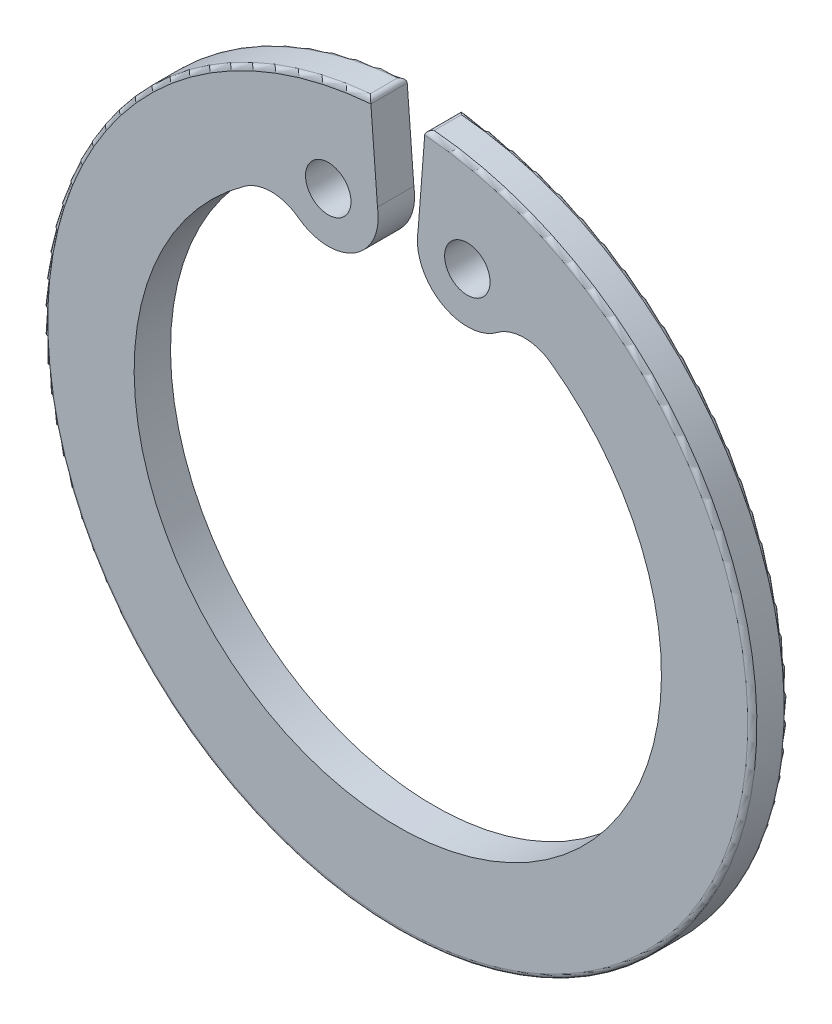
ISO-10303-21;
HEADER;
FILE_DESCRIPTION(('STEP AP214'),'2;1');
FILE_NAME('part.step','',(''),(''),'','','');
FILE_SCHEMA(('AUTOMOTIVE_DESIGN { 1 0 10303 214 1 1 1 1 }'));
ENDSEC;
DATA;
#1=APPLICATION_CONTEXT('core data for automotive mechanical design processes');
#2=APPLICATION_PROTOCOL_DEFINITION('international standard','automotive_design',2000,#1);
#3=PRODUCT_CONTEXT('',#1,'mechanical');
#4=PRODUCT('Part','Part','',(#3));
#5=PRODUCT_RELATED_PRODUCT_CATEGORY('part','',(#4));
#6=PRODUCT_DEFINITION_FORMATION('','',#4);
#7=PRODUCT_DEFINITION_CONTEXT('part definition',#1,'design');
#8=PRODUCT_DEFINITION('design','',#6,#7);
#9=PRODUCT_DEFINITION_SHAPE('','',#8);
#10=(LENGTH_UNIT() NAMED_UNIT(*) SI_UNIT(.MILLI.,.METRE.));
#11=(NAMED_UNIT(*) PLANE_ANGLE_UNIT() SI_UNIT($,.RADIAN.));
#12=(NAMED_UNIT(*) SI_UNIT($,.STERADIAN.) SOLID_ANGLE_UNIT());
#13=UNCERTAINTY_MEASURE_WITH_UNIT(LENGTH_MEASURE(1.E-05),#10,'distance_accuracy_value','');
#14=(GEOMETRIC_REPRESENTATION_CONTEXT(3) GLOBAL_UNCERTAINTY_ASSIGNED_CONTEXT((#13)) GLOBAL_UNIT_ASSIGNED_CONTEXT((#10,
#11,#12)) REPRESENTATION_CONTEXT('',''));
#15=CARTESIAN_POINT('',(0.,0.,0.));
#16=DIRECTION('',(0.,0.,1.));
#17=DIRECTION('',(1.,0.,0.));
#18=AXIS2_PLACEMENT_3D('',#15,#16,#17);
#19=CARTESIAN_POINT('',(0.,0.,-1.));
#20=DIRECTION('',(0.,0.,1.));
#21=DIRECTION('',(1.,0.,0.));
#22=AXIS2_PLACEMENT_3D('',#19,#20,#21);
#23=CYLINDRICAL_SURFACE('',#22,14.5);
#24=CARTESIAN_POINT('',(0.,0.,1.));
#25=DIRECTION('',(0.,0.,1.));
#26=DIRECTION('',(1.,0.,0.));
#27=AXIS2_PLACEMENT_3D('',#24,#25,#26);
#28=CIRCLE('',#27,14.5);
#29=CARTESIAN_POINT('',(-8.41002014883928,11.8119245297334,1.));
#30=VERTEX_POINT('',#29);
#31=CARTESIAN_POINT('',(8.4100201488393,11.8119245297334,1.));
#32=VERTEX_POINT('',#31);
#33=EDGE_CURVE('E270',#30,#32,#28,.T.);
#34=ORIENTED_EDGE('',*,*,#33,.T.);
#35=DIRECTION('',(0.,0.,1.));
#36=VECTOR('',#35,1.);
#37=CARTESIAN_POINT('',(8.4100201488393,11.8119245297334,-1.));
#38=LINE('',#37,#36);
#39=CARTESIAN_POINT('',(8.4100201488393,11.8119245297334,-1.));
#40=VERTEX_POINT('',#39);
#41=EDGE_CURVE('E163',#32,#40,#38,.F.);
#42=ORIENTED_EDGE('',*,*,#41,.T.);
#43=CARTESIAN_POINT('',(0.,0.,-1.));
#44=DIRECTION('',(0.,0.,1.));
#45=DIRECTION('',(1.,0.,0.));
#46=AXIS2_PLACEMENT_3D('',#43,#44,#45);
#47=CIRCLE('',#46,14.5);
#48=CARTESIAN_POINT('',(-8.41002014883928,11.8119245297334,-1.));
#49=VERTEX_POINT('',#48);
#50=EDGE_CURVE('E235',#49,#40,#47,.T.);
#51=ORIENTED_EDGE('',*,*,#50,.F.);
#52=DIRECTION('',(0.,0.,1.));
#53=VECTOR('',#52,1.);
#54=CARTESIAN_POINT('',(-8.41002014883928,11.8119245297334,-1.));
#55=LINE('',#54,#53);
#56=EDGE_CURVE('E156',#49,#30,#55,.T.);
#57=ORIENTED_EDGE('',*,*,#56,.T.);
#58=EDGE_LOOP('',(#34,#42,#51,#57));
#59=FACE_BOUND('',#58,.T.);
#60=ADVANCED_FACE('F33',(#59),#23,.F.);
#61=CARTESIAN_POINT('',(0.,0.,-1.));
#62=DIRECTION('',(-0.997037030524286,0.0769230769230779,0.));
#63=DIRECTION('',(-0.0769230769230779,-0.997037030524286,0.));
#64=AXIS2_PLACEMENT_3D('',#61,#62,#63);
#65=PLANE('',#64);
#66=DIRECTION('',(-0.0769230769230779,-0.997037030524286,0.));
#67=VECTOR('',#66,1.);
#68=CARTESIAN_POINT('',(0.,0.,1.));
#69=LINE('',#68,#67);
#70=CARTESIAN_POINT('',(1.48064435037849,19.1913442027309,1.));
#71=VERTEX_POINT('',#70);
#72=CARTESIAN_POINT('',(1.11538461538463,14.4570369426021,1.));
#73=VERTEX_POINT('',#72);
#74=EDGE_CURVE('E54',#71,#73,#69,.T.);
#75=ORIENTED_EDGE('',*,*,#74,.F.);
#76=DIRECTION('',(0.,0.,1.));
#77=VECTOR('',#76,1.);
#78=CARTESIAN_POINT('',(1.48064435037849,19.1913442027309,-1.));
#79=LINE('',#78,#77);
#80=CARTESIAN_POINT('',(1.48064435037849,19.1913442027309,-1.));
#81=VERTEX_POINT('',#80);
#82=EDGE_CURVE('E11',#71,#81,#79,.F.);
#83=ORIENTED_EDGE('',*,*,#82,.T.);
#84=DIRECTION('',(-0.0769230769230779,-0.997037030524286,0.));
#85=VECTOR('',#84,1.);
#86=CARTESIAN_POINT('',(0.,0.,-1.));
#87=LINE('',#86,#85);
#88=CARTESIAN_POINT('',(1.11538461538463,14.4570369426021,-1.));
#89=VERTEX_POINT('',#88);
#90=EDGE_CURVE('E125',#81,#89,#87,.T.);
#91=ORIENTED_EDGE('',*,*,#90,.T.);
#92=DIRECTION('',(0.,0.,1.));
#93=VECTOR('',#92,1.);
#94=CARTESIAN_POINT('',(1.11538461538463,14.4570369426021,-1.));
#95=LINE('',#94,#93);
#96=EDGE_CURVE('E129',#89,#73,#95,.T.);
#97=ORIENTED_EDGE('',*,*,#96,.T.);
#98=EDGE_LOOP('',(#75,#83,#91,#97));
#99=FACE_BOUND('',#98,.T.);
#100=ADVANCED_FACE('F127',(#99),#65,.T.);
#101=CARTESIAN_POINT('',(0.,0.,-1.));
#102=DIRECTION('',(0.,0.,1.));
#103=DIRECTION('',(1.,0.,0.));
#104=AXIS2_PLACEMENT_3D('',#101,#102,#103);
#105=CYLINDRICAL_SURFACE('',#104,19.5);
#106=DIRECTION('',(0.,0.,1.));
#107=VECTOR('',#106,1.);
#108=CARTESIAN_POINT('',(-1.75236988863303,19.4211019196495,-1.));
#109=LINE('',#108,#107);
#110=CARTESIAN_POINT('',(-1.75236988863303,19.4211019196495,0.75));
#111=VERTEX_POINT('',#110);
#112=CARTESIAN_POINT('',(-1.75236988863303,19.4211019196495,-0.75));
#113=VERTEX_POINT('',#112);
#114=EDGE_CURVE('E179',#111,#113,#109,.F.);
#115=ORIENTED_EDGE('',*,*,#114,.T.);
#116=CARTESIAN_POINT('',(0.,0.,-0.75));
#117=DIRECTION('',(0.,0.,1.));
#118=DIRECTION('',(1.,0.,0.));
#119=AXIS2_PLACEMENT_3D('',#116,#117,#118);
#120=CIRCLE('',#119,19.5);
#121=CARTESIAN_POINT('',(1.75236988863306,19.4211019196495,-0.75));
#122=VERTEX_POINT('',#121);
#123=EDGE_CURVE('E181',#113,#122,#120,.T.);
#124=ORIENTED_EDGE('',*,*,#123,.T.);
#125=DIRECTION('',(0.,0.,1.));
#126=VECTOR('',#125,1.);
#127=CARTESIAN_POINT('',(1.75236988863306,19.4211019196495,-1.));
#128=LINE('',#127,#126);
#129=CARTESIAN_POINT('',(1.75236988863306,19.4211019196495,0.75));
#130=VERTEX_POINT('',#129);
#131=EDGE_CURVE('E175',#122,#130,#128,.T.);
#132=ORIENTED_EDGE('',*,*,#131,.T.);
#133=CARTESIAN_POINT('',(0.,0.,0.75));
#134=DIRECTION('',(0.,0.,1.));
#135=DIRECTION('',(1.,0.,0.));
#136=AXIS2_PLACEMENT_3D('',#133,#134,#135);
#137=CIRCLE('',#136,19.5);
#138=EDGE_CURVE('E177',#130,#111,#137,.F.);
#139=ORIENTED_EDGE('',*,*,#138,.T.);
#140=EDGE_LOOP('',(#115,#124,#132,#139));
#141=FACE_BOUND('',#140,.T.);
#142=ADVANCED_FACE('F238',(#141),#105,.T.);
#143=CARTESIAN_POINT('',(0.,0.,-1.));
#144=DIRECTION('',(0.997037030524286,0.0769230769230759,0.));
#145=DIRECTION('',(-0.0769230769230759,0.997037030524286,0.));
#146=AXIS2_PLACEMENT_3D('',#143,#144,#145);
#147=PLANE('',#146);
#148=DIRECTION('',(-0.0769230769230759,0.997037030524286,0.));
#149=VECTOR('',#148,1.);
#150=CARTESIAN_POINT('',(0.,0.,-1.));
#151=LINE('',#150,#149);
#152=CARTESIAN_POINT('',(-1.1153846153846,14.4570369426021,-1.));
#153=VERTEX_POINT('',#152);
#154=CARTESIAN_POINT('',(-1.48064435037845,19.1913442027309,-1.));
#155=VERTEX_POINT('',#154);
#156=EDGE_CURVE('E134',#153,#155,#151,.T.);
#157=ORIENTED_EDGE('',*,*,#156,.T.);
#158=DIRECTION('',(0.,0.,1.));
#159=VECTOR('',#158,1.);
#160=CARTESIAN_POINT('',(-1.48064435037845,19.1913442027309,-1.));
#161=LINE('',#160,#159);
#162=CARTESIAN_POINT('',(-1.48064435037845,19.1913442027309,1.));
#163=VERTEX_POINT('',#162);
#164=EDGE_CURVE('E187',#155,#163,#161,.T.);
#165=ORIENTED_EDGE('',*,*,#164,.T.);
#166=DIRECTION('',(-0.0769230769230759,0.997037030524286,0.));
#167=VECTOR('',#166,1.);
#168=CARTESIAN_POINT('',(0.,0.,1.));
#169=LINE('',#168,#167);
#170=CARTESIAN_POINT('',(-1.1153846153846,14.4570369426021,1.));
#171=VERTEX_POINT('',#170);
#172=EDGE_CURVE('E245',#171,#163,#169,.T.);
#173=ORIENTED_EDGE('',*,*,#172,.F.);
#174=DIRECTION('',(0.,0.,1.));
#175=VECTOR('',#174,1.);
#176=CARTESIAN_POINT('',(-1.1153846153846,14.4570369426021,-1.));
#177=LINE('',#176,#175);
#178=EDGE_CURVE('E154',#153,#171,#177,.T.);
#179=ORIENTED_EDGE('',*,*,#178,.F.);
#180=EDGE_LOOP('',(#157,#165,#173,#179));
#181=FACE_BOUND('',#180,.T.);
#182=ADVANCED_FACE('F249',(#181),#147,.T.);
#183=CARTESIAN_POINT('',(0.,0.,-1.));
#184=DIRECTION('',(0.,0.,1.));
#185=DIRECTION('',(1.,0.,0.));
#186=AXIS2_PLACEMENT_3D('',#183,#184,#185);
#187=PLANE('',#186);
#188=CARTESIAN_POINT('',(1.48076923076925,19.1929628375925,-1.));
#189=VERTEX_POINT('',#188);
#190=EDGE_CURVE('E133',#189,#81,#87,.T.);
#191=ORIENTED_EDGE('',*,*,#190,.F.);
#192=CARTESIAN_POINT('',(0.,0.,-1.));
#193=DIRECTION('',(0.,0.,1.));
#194=DIRECTION('',(1.,0.,0.));
#195=AXIS2_PLACEMENT_3D('',#192,#193,#194);
#196=CIRCLE('',#195,19.25);
#197=CARTESIAN_POINT('',(-1.48076923076921,19.1929628375925,-1.));
#198=VERTEX_POINT('',#197);
#199=EDGE_CURVE('E184',#189,#198,#196,.F.);
#200=ORIENTED_EDGE('',*,*,#199,.T.);
#201=EDGE_CURVE('E231',#155,#198,#151,.T.);
#202=ORIENTED_EDGE('',*,*,#201,.F.);
#203=ORIENTED_EDGE('',*,*,#156,.F.);
#204=CARTESIAN_POINT('',(-3.82482119121912,13.9864485433294,-1.));
#205=DIRECTION('',(0.,0.,1.));
#206=DIRECTION('',(1.,0.,0.));
#207=AXIS2_PLACEMENT_3D('',#204,#205,#206);
#208=CIRCLE('',#207,2.75);
#209=CARTESIAN_POINT('',(-5.46706644457654,11.7806537822909,-1.));
#210=VERTEX_POINT('',#209);
#211=EDGE_CURVE('E254',#153,#210,#208,.F.);
#212=ORIENTED_EDGE('',*,*,#211,.T.);
#213=CARTESIAN_POINT('',(-6.96001667490147,9.77538581771039,-1.));
#214=DIRECTION('',(0.,0.,1.));
#215=DIRECTION('',(1.,0.,0.));
#216=AXIS2_PLACEMENT_3D('',#213,#214,#215);
#217=CIRCLE('',#216,2.5);
#218=EDGE_CURVE('E171',#210,#49,#217,.T.);
#219=ORIENTED_EDGE('',*,*,#218,.T.);
#220=ORIENTED_EDGE('',*,*,#50,.T.);
#221=CARTESIAN_POINT('',(6.96001667490149,9.77538581771037,-1.));
#222=DIRECTION('',(0.,0.,1.));
#223=DIRECTION('',(1.,0.,0.));
#224=AXIS2_PLACEMENT_3D('',#221,#222,#223);
#225=CIRCLE('',#224,2.5);
#226=CARTESIAN_POINT('',(5.46706644457657,11.7806537822909,-1.));
#227=VERTEX_POINT('',#226);
#228=EDGE_CURVE('E142',#40,#227,#225,.T.);
#229=ORIENTED_EDGE('',*,*,#228,.T.);
#230=CARTESIAN_POINT('',(3.82482119121915,13.9864485433294,-1.));
#231=DIRECTION('',(0.,0.,1.));
#232=DIRECTION('',(1.,0.,0.));
#233=AXIS2_PLACEMENT_3D('',#230,#231,#232);
#234=CIRCLE('',#233,2.75);
#235=EDGE_CURVE('E137',#227,#89,#234,.F.);
#236=ORIENTED_EDGE('',*,*,#235,.T.);
#237=ORIENTED_EDGE('',*,*,#90,.F.);
#238=EDGE_LOOP('',(#191,#200,#202,#203,#212,#219,#220,#229,#236,#237));
#239=FACE_BOUND('',#238,.T.);
#240=CARTESIAN_POINT('',(3.82482119121915,13.9864485433294,-1.));
#241=DIRECTION('',(0.,0.,1.));
#242=DIRECTION('',(1.,0.,0.));
#243=AXIS2_PLACEMENT_3D('',#240,#241,#242);
#244=CIRCLE('',#243,1.25);
#245=CARTESIAN_POINT('',(5.07482119121915,13.9864485433294,-1.));
#246=VERTEX_POINT('',#245);
#247=EDGE_CURVE('E147',#246,#246,#244,.F.);
#248=ORIENTED_EDGE('',*,*,#247,.F.);
#249=EDGE_LOOP('',(#248));
#250=FACE_BOUND('',#249,.T.);
#251=CARTESIAN_POINT('',(-3.82482119121912,13.9864485433294,-1.));
#252=DIRECTION('',(0.,0.,1.));
#253=DIRECTION('',(1.,0.,0.));
#254=AXIS2_PLACEMENT_3D('',#251,#252,#253);
#255=CIRCLE('',#254,1.25);
#256=CARTESIAN_POINT('',(-2.57482119121912,13.9864485433294,-1.));
#257=VERTEX_POINT('',#256);
#258=EDGE_CURVE('E260',#257,#257,#255,.F.);
#259=ORIENTED_EDGE('',*,*,#258,.F.);
#260=EDGE_LOOP('',(#259));
#261=FACE_BOUND('',#260,.T.);
#262=ADVANCED_FACE('F138',(#239,#250,#261),#187,.F.);
#263=CARTESIAN_POINT('',(0.,0.,1.));
#264=DIRECTION('',(0.,0.,1.));
#265=DIRECTION('',(1.,0.,0.));
#266=AXIS2_PLACEMENT_3D('',#263,#264,#265);
#267=PLANE('',#266);
#268=CARTESIAN_POINT('',(-3.82482119121912,13.9864485433294,1.));
#269=DIRECTION('',(0.,0.,1.));
#270=DIRECTION('',(1.,0.,0.));
#271=AXIS2_PLACEMENT_3D('',#268,#269,#270);
#272=CIRCLE('',#271,1.25);
#273=CARTESIAN_POINT('',(-2.57482119121912,13.9864485433294,1.));
#274=VERTEX_POINT('',#273);
#275=EDGE_CURVE('E259',#274,#274,#272,.T.);
#276=ORIENTED_EDGE('',*,*,#275,.F.);
#277=EDGE_LOOP('',(#276));
#278=FACE_BOUND('',#277,.T.);
#279=CARTESIAN_POINT('',(3.82482119121915,13.9864485433294,1.));
#280=DIRECTION('',(0.,0.,1.));
#281=DIRECTION('',(1.,0.,0.));
#282=AXIS2_PLACEMENT_3D('',#279,#280,#281);
#283=CIRCLE('',#282,1.25);
#284=CARTESIAN_POINT('',(5.07482119121915,13.9864485433294,1.));
#285=VERTEX_POINT('',#284);
#286=EDGE_CURVE('E146',#285,#285,#283,.T.);
#287=ORIENTED_EDGE('',*,*,#286,.F.);
#288=EDGE_LOOP('',(#287));
#289=FACE_BOUND('',#288,.T.);
#290=CARTESIAN_POINT('',(-1.48076923076921,19.1929628375925,1.));
#291=VERTEX_POINT('',#290);
#292=EDGE_CURVE('E240',#163,#291,#169,.T.);
#293=ORIENTED_EDGE('',*,*,#292,.T.);
#294=CARTESIAN_POINT('',(0.,0.,1.));
#295=DIRECTION('',(0.,0.,1.));
#296=DIRECTION('',(1.,0.,0.));
#297=AXIS2_PLACEMENT_3D('',#294,#295,#296);
#298=CIRCLE('',#297,19.25);
#299=CARTESIAN_POINT('',(1.48076923076925,19.1929628375925,1.));
#300=VERTEX_POINT('',#299);
#301=EDGE_CURVE('E47',#291,#300,#298,.T.);
#302=ORIENTED_EDGE('',*,*,#301,.T.);
#303=EDGE_CURVE('E242',#300,#71,#69,.T.);
#304=ORIENTED_EDGE('',*,*,#303,.T.);
#305=ORIENTED_EDGE('',*,*,#74,.T.);
#306=CARTESIAN_POINT('',(3.82482119121915,13.9864485433294,1.));
#307=DIRECTION('',(0.,0.,1.));
#308=DIRECTION('',(1.,0.,0.));
#309=AXIS2_PLACEMENT_3D('',#306,#307,#308);
#310=CIRCLE('',#309,2.75);
#311=CARTESIAN_POINT('',(5.46706644457657,11.7806537822909,1.));
#312=VERTEX_POINT('',#311);
#313=EDGE_CURVE('E152',#73,#312,#310,.T.);
#314=ORIENTED_EDGE('',*,*,#313,.T.);
#315=CARTESIAN_POINT('',(6.96001667490149,9.77538581771037,1.));
#316=DIRECTION('',(0.,0.,1.));
#317=DIRECTION('',(1.,0.,0.));
#318=AXIS2_PLACEMENT_3D('',#315,#316,#317);
#319=CIRCLE('',#318,2.5);
#320=EDGE_CURVE('E168',#312,#32,#319,.F.);
#321=ORIENTED_EDGE('',*,*,#320,.T.);
#322=ORIENTED_EDGE('',*,*,#33,.F.);
#323=CARTESIAN_POINT('',(-6.96001667490147,9.77538581771039,1.));
#324=DIRECTION('',(0.,0.,1.));
#325=DIRECTION('',(1.,0.,0.));
#326=AXIS2_PLACEMENT_3D('',#323,#324,#325);
#327=CIRCLE('',#326,2.5);
#328=CARTESIAN_POINT('',(-5.46706644457654,11.7806537822909,1.));
#329=VERTEX_POINT('',#328);
#330=EDGE_CURVE('E173',#30,#329,#327,.F.);
#331=ORIENTED_EDGE('',*,*,#330,.T.);
#332=CARTESIAN_POINT('',(-3.82482119121912,13.9864485433294,1.));
#333=DIRECTION('',(0.,0.,1.));
#334=DIRECTION('',(1.,0.,0.));
#335=AXIS2_PLACEMENT_3D('',#332,#333,#334);
#336=CIRCLE('',#335,2.75);
#337=EDGE_CURVE('E263',#329,#171,#336,.T.);
#338=ORIENTED_EDGE('',*,*,#337,.T.);
#339=ORIENTED_EDGE('',*,*,#172,.T.);
#340=EDGE_LOOP('',(#293,#302,#304,#305,#314,#321,#322,#331,#338,#339));
#341=FACE_BOUND('',#340,.T.);
#342=ADVANCED_FACE('F275',(#278,#289,#341),#267,.T.);
#343=CARTESIAN_POINT('',(-3.82482119121912,13.9864485433294,8.77817459305202));
#344=DIRECTION('',(0.,0.,-1.));
#345=DIRECTION('',(-1.,0.,0.));
#346=AXIS2_PLACEMENT_3D('',#343,#344,#345);
#347=CYLINDRICAL_SURFACE('',#346,2.75);
#348=ORIENTED_EDGE('',*,*,#337,.F.);
#349=DIRECTION('',(0.,0.,-1.));
#350=VECTOR('',#349,1.);
#351=CARTESIAN_POINT('',(-5.46706644457654,11.7806537822909,8.77817459305202));
#352=LINE('',#351,#350);
#353=EDGE_CURVE('E165',#329,#210,#352,.T.);
#354=ORIENTED_EDGE('',*,*,#353,.T.);
#355=ORIENTED_EDGE('',*,*,#211,.F.);
#356=ORIENTED_EDGE('',*,*,#178,.T.);
#357=EDGE_LOOP('',(#348,#354,#355,#356));
#358=FACE_BOUND('',#357,.T.);
#359=ADVANCED_FACE('F257',(#358),#347,.T.);
#360=CARTESIAN_POINT('',(-3.82482119121912,13.9864485433294,8.77817459305202));
#361=DIRECTION('',(0.,0.,-1.));
#362=DIRECTION('',(-1.,0.,0.));
#363=AXIS2_PLACEMENT_3D('',#360,#361,#362);
#364=CYLINDRICAL_SURFACE('',#363,1.25);
#365=ORIENTED_EDGE('',*,*,#258,.T.);
#366=EDGE_LOOP('',(#365));
#367=FACE_BOUND('',#366,.T.);
#368=ORIENTED_EDGE('',*,*,#275,.T.);
#369=EDGE_LOOP('',(#368));
#370=FACE_BOUND('',#369,.T.);
#371=ADVANCED_FACE('F295',(#367,#370),#364,.F.);
#372=CARTESIAN_POINT('',(3.82482119121915,13.9864485433294,8.77817459305202));
#373=DIRECTION('',(0.,0.,-1.));
#374=DIRECTION('',(-1.,0.,0.));
#375=AXIS2_PLACEMENT_3D('',#372,#373,#374);
#376=CYLINDRICAL_SURFACE('',#375,2.75);
#377=ORIENTED_EDGE('',*,*,#235,.F.);
#378=DIRECTION('',(0.,0.,-1.));
#379=VECTOR('',#378,1.);
#380=CARTESIAN_POINT('',(5.46706644457657,11.7806537822909,8.77817459305202));
#381=LINE('',#380,#379);
#382=EDGE_CURVE('E153',#227,#312,#381,.F.);
#383=ORIENTED_EDGE('',*,*,#382,.T.);
#384=ORIENTED_EDGE('',*,*,#313,.F.);
#385=ORIENTED_EDGE('',*,*,#96,.F.);
#386=EDGE_LOOP('',(#377,#383,#384,#385));
#387=FACE_BOUND('',#386,.T.);
#388=ADVANCED_FACE('F150',(#387),#376,.T.);
#389=CARTESIAN_POINT('',(3.82482119121915,13.9864485433294,8.77817459305202));
#390=DIRECTION('',(0.,0.,-1.));
#391=DIRECTION('',(-1.,0.,0.));
#392=AXIS2_PLACEMENT_3D('',#389,#390,#391);
#393=CYLINDRICAL_SURFACE('',#392,1.25);
#394=ORIENTED_EDGE('',*,*,#247,.T.);
#395=EDGE_LOOP('',(#394));
#396=FACE_BOUND('',#395,.T.);
#397=ORIENTED_EDGE('',*,*,#286,.T.);
#398=EDGE_LOOP('',(#397));
#399=FACE_BOUND('',#398,.T.);
#400=ADVANCED_FACE('F288',(#396,#399),#393,.F.);
#401=CARTESIAN_POINT('',(6.96001667490149,9.77538581771037,-1.));
#402=DIRECTION('',(0.,0.,1.));
#403=DIRECTION('',(1.,0.,0.));
#404=AXIS2_PLACEMENT_3D('',#401,#402,#403);
#405=CYLINDRICAL_SURFACE('',#404,2.5);
#406=ORIENTED_EDGE('',*,*,#228,.F.);
#407=ORIENTED_EDGE('',*,*,#41,.F.);
#408=ORIENTED_EDGE('',*,*,#320,.F.);
#409=ORIENTED_EDGE('',*,*,#382,.F.);
#410=EDGE_LOOP('',(#406,#407,#408,#409));
#411=FACE_BOUND('',#410,.T.);
#412=ADVANCED_FACE('F282',(#411),#405,.F.);
#413=CARTESIAN_POINT('',(-6.96001667490147,9.77538581771039,-1.));
#414=DIRECTION('',(0.,0.,-1.));
#415=DIRECTION('',(-1.,0.,0.));
#416=AXIS2_PLACEMENT_3D('',#413,#414,#415);
#417=CYLINDRICAL_SURFACE('',#416,2.5);
#418=ORIENTED_EDGE('',*,*,#330,.F.);
#419=ORIENTED_EDGE('',*,*,#56,.F.);
#420=ORIENTED_EDGE('',*,*,#218,.F.);
#421=ORIENTED_EDGE('',*,*,#353,.F.);
#422=EDGE_LOOP('',(#418,#419,#420,#421));
#423=FACE_BOUND('',#422,.T.);
#424=ADVANCED_FACE('F278',(#423),#417,.F.);
#425=CARTESIAN_POINT('',(0.,0.,0.75));
#426=DIRECTION('',(0.,0.,1.));
#427=DIRECTION('',(1.,0.,0.));
#428=AXIS2_PLACEMENT_3D('',#425,#426,#427);
#429=TOROIDAL_SURFACE('',#428,19.25,0.25);
#430=CARTESIAN_POINT('',(1.4807744863542,19.1929624321146,1.));
#431=CARTESIAN_POINT('',(1.48169303067416,19.2041649808295,1.00001873739235));
#432=CARTESIAN_POINT('',(1.48340089608226,19.2152723424615,0.999243297746793));
#433=CARTESIAN_POINT('',(1.48819528393374,19.2368898741163,0.996272502460333));
#434=CARTESIAN_POINT('',(1.49126968117334,19.2474043994544,0.994089560429636));
#435=CARTESIAN_POINT('',(1.49860916045737,19.267606888873,0.988474896024807));
#436=CARTESIAN_POINT('',(1.50287089141383,19.2772970804848,0.985046680112327));
#437=CARTESIAN_POINT('',(1.51236690817739,19.2957485679843,0.977151744312638));
#438=CARTESIAN_POINT('',(1.51760339177878,19.30450769304,0.972682671749519));
#439=CARTESIAN_POINT('',(1.53112643206685,19.3243803499217,0.960919393398235));
#440=CARTESIAN_POINT('',(1.53978605332044,19.3349976586965,0.953216257509274));
#441=CARTESIAN_POINT('',(1.55812881415347,19.3542421507029,0.936639581023667));
#442=CARTESIAN_POINT('',(1.56781386255268,19.3628655238035,0.927763849769693));
#443=CARTESIAN_POINT('',(1.59167578545928,19.3811518898874,0.90565915062282));
#444=CARTESIAN_POINT('',(1.60615987636892,19.3899625020027,0.892058572967335));
#445=CARTESIAN_POINT('',(1.63580604197597,19.4043145510971,0.863922652393296));
#446=CARTESIAN_POINT('',(1.65096889128997,19.4098521449365,0.849386232730965));
#447=CARTESIAN_POINT('',(1.68017838706373,19.4175400167984,0.821135508497479));
#448=CARTESIAN_POINT('',(1.6942017607418,19.4199516413546,0.807465972303091));
#449=CARTESIAN_POINT('',(1.72222771154083,19.422390044503,0.779942396481861));
#450=CARTESIAN_POINT('',(1.73623027277709,19.422421674883,0.766088789799199));
#451=CARTESIAN_POINT('',(1.75087050963174,19.4212337928231,0.751495483624834));
#452=CARTESIAN_POINT('',(1.75162037240508,19.4211695439364,0.750747721042084));
#453=CARTESIAN_POINT('',(1.75236988863306,19.4211019196495,0.75));
#454=B_SPLINE_CURVE_WITH_KNOTS('',3,(#430,#431,#432,#433,#434,#435,#436,#437,#438,#439,#440,
#441,#442,#443,#444,#445,#446,#447,#448,#449,#450,#451,#452,#453),.UNSPECIFIED.,.F.,.F.,(4,2,2,
2,2,2,2,2,2,2,2,4),(0.,0.0336210562733325,0.0669495707022273,0.100184956582667,
0.133496207135493,0.180389700856295,0.227372074289389,0.292226664354988,0.357157255411078,
0.416207578293477,0.475137519615947,0.478320281636057),.UNSPECIFIED.);
#455=EDGE_CURVE('E213',#300,#130,#454,.T.);
#456=ORIENTED_EDGE('',*,*,#455,.F.);
#457=ORIENTED_EDGE('',*,*,#301,.F.);
#458=CARTESIAN_POINT('',(-1.48077448635416,19.1929624321146,1.));
#459=CARTESIAN_POINT('',(-1.48169303067412,19.2041649808295,1.00001873739235));
#460=CARTESIAN_POINT('',(-1.48340089608222,19.2152723424615,0.999243297746793));
#461=CARTESIAN_POINT('',(-1.4881952839337,19.2368898741163,0.996272502460334));
#462=CARTESIAN_POINT('',(-1.4912696811733,19.2474043994544,0.994089560429637));
#463=CARTESIAN_POINT('',(-1.49860916045733,19.267606888873,0.988474896024808));
#464=CARTESIAN_POINT('',(-1.50287089141379,19.2772970804848,0.985046680112328));
#465=CARTESIAN_POINT('',(-1.51236690817735,19.2957485679843,0.97715174431264));
#466=CARTESIAN_POINT('',(-1.51760339177874,19.30450769304,0.972682671749522));
#467=CARTESIAN_POINT('',(-1.53112643206681,19.3243803499217,0.960919393398239));
#468=CARTESIAN_POINT('',(-1.5397860533204,19.3349976586965,0.953216257509277));
#469=CARTESIAN_POINT('',(-1.55812881415343,19.3542421507029,0.936639581023667));
#470=CARTESIAN_POINT('',(-1.56781386255264,19.3628655238035,0.927763849769692));
#471=CARTESIAN_POINT('',(-1.59167578545924,19.3811518898874,0.905659150622824));
#472=CARTESIAN_POINT('',(-1.60615987636889,19.3899625020027,0.892058572967346));
#473=CARTESIAN_POINT('',(-1.63580604197593,19.4043145510971,0.863922652393291));
#474=CARTESIAN_POINT('',(-1.65096889128991,19.4098521449365,0.849386232730936));
#475=CARTESIAN_POINT('',(-1.68017838706371,19.4175400167984,0.821135508497495));
#476=CARTESIAN_POINT('',(-1.69420176074184,19.4199516413546,0.807465972303169));
#477=CARTESIAN_POINT('',(-1.72222771154071,19.422390044503,0.779942396481782));
#478=CARTESIAN_POINT('',(-1.73623027277676,19.422421674883,0.766088789798902));
#479=CARTESIAN_POINT('',(-1.75087050963167,19.4212337928231,0.751495483624802));
#480=CARTESIAN_POINT('',(-1.75162037240503,19.4211695439364,0.750747721042067));
#481=CARTESIAN_POINT('',(-1.75236988863303,19.4211019196495,0.75));
#482=B_SPLINE_CURVE_WITH_KNOTS('',3,(#458,#459,#460,#461,#462,#463,#464,#465,#466,#467,#468,
#469,#470,#471,#472,#473,#474,#475,#476,#477,#478,#479,#480,#481),.UNSPECIFIED.,.F.,.F.,(4,2,2,
2,2,2,2,2,2,2,2,4),(0.,0.0336210562733325,0.0669495707022235,0.100184956582663,
0.133496207135488,0.18038970085629,0.227372074289386,0.292226664354989,0.35715725541108,
0.416207578293478,0.475137519615948,0.478320281636057),.UNSPECIFIED.);
#483=EDGE_CURVE('E38',#111,#291,#482,.F.);
#484=ORIENTED_EDGE('',*,*,#483,.F.);
#485=ORIENTED_EDGE('',*,*,#138,.F.);
#486=EDGE_LOOP('',(#456,#457,#484,#485));
#487=FACE_BOUND('',#486,.T.);
#488=ADVANCED_FACE('F35',(#487),#429,.T.);
#489=CARTESIAN_POINT('',(-1.72990360800953,19.1721134335001,-1.));
#490=DIRECTION('',(0.,0.,1.));
#491=DIRECTION('',(1.,0.,0.));
#492=AXIS2_PLACEMENT_3D('',#489,#490,#491);
#493=CYLINDRICAL_SURFACE('',#492,0.25);
#494=ORIENTED_EDGE('',*,*,#164,.F.);
#495=ORIENTED_EDGE('',*,*,#201,.T.);
#496=CARTESIAN_POINT('',(-1.48077448635416,19.1929624321146,-1.));
#497=CARTESIAN_POINT('',(-1.48169303067412,19.2041649808295,-1.00001873739235));
#498=CARTESIAN_POINT('',(-1.48340089608222,19.2152723424615,-0.999243297746793));
#499=CARTESIAN_POINT('',(-1.4881952839337,19.2368898741163,-0.996272502460334));
#500=CARTESIAN_POINT('',(-1.4912696811733,19.2474043994544,-0.994089560429637));
#501=CARTESIAN_POINT('',(-1.49860916045733,19.267606888873,-0.988474896024808));
#502=CARTESIAN_POINT('',(-1.50287089141379,19.2772970804848,-0.985046680112328));
#503=CARTESIAN_POINT('',(-1.51236690817735,19.2957485679843,-0.97715174431264));
#504=CARTESIAN_POINT('',(-1.51760339177874,19.30450769304,-0.972682671749522));
#505=CARTESIAN_POINT('',(-1.53112643206681,19.3243803499217,-0.960919393398239));
#506=CARTESIAN_POINT('',(-1.5397860533204,19.3349976586965,-0.953216257509277));
#507=CARTESIAN_POINT('',(-1.55812881415343,19.3542421507029,-0.936639581023667));
#508=CARTESIAN_POINT('',(-1.56781386255264,19.3628655238035,-0.927763849769692));
#509=CARTESIAN_POINT('',(-1.59167578545924,19.3811518898874,-0.905659150622824));
#510=CARTESIAN_POINT('',(-1.60615987636889,19.3899625020027,-0.892058572967346));
#511=CARTESIAN_POINT('',(-1.63580604197593,19.4043145510971,-0.863922652393291));
#512=CARTESIAN_POINT('',(-1.65096889128991,19.4098521449365,-0.849386232730936));
#513=CARTESIAN_POINT('',(-1.68017838706371,19.4175400167984,-0.821135508497495));
#514=CARTESIAN_POINT('',(-1.69420176074184,19.4199516413546,-0.807465972303169));
#515=CARTESIAN_POINT('',(-1.72222771154071,19.422390044503,-0.779942396481782));
#516=CARTESIAN_POINT('',(-1.73623027277676,19.422421674883,-0.766088789798902));
#517=CARTESIAN_POINT('',(-1.75087050963167,19.4212337928231,-0.751495483624802));
#518=CARTESIAN_POINT('',(-1.75162037240503,19.4211695439364,-0.750747721042067));
#519=CARTESIAN_POINT('',(-1.75236988863303,19.4211019196495,-0.75));
#520=B_SPLINE_CURVE_WITH_KNOTS('',3,(#496,#497,#498,#499,#500,#501,#502,#503,#504,#505,#506,
#507,#508,#509,#510,#511,#512,#513,#514,#515,#516,#517,#518,#519),.UNSPECIFIED.,.F.,.F.,(4,2,2,
2,2,2,2,2,2,2,2,4),(0.,0.0336210562733325,0.0669495707022235,0.100184956582663,
0.133496207135488,0.18038970085629,0.227372074289386,0.292226664354989,0.35715725541108,
0.416207578293478,0.475137519615948,0.478320281636057),.UNSPECIFIED.);
#521=EDGE_CURVE('E198',#113,#198,#520,.F.);
#522=ORIENTED_EDGE('',*,*,#521,.F.);
#523=ORIENTED_EDGE('',*,*,#114,.F.);
#524=ORIENTED_EDGE('',*,*,#483,.T.);
#525=ORIENTED_EDGE('',*,*,#292,.F.);
#526=EDGE_LOOP('',(#494,#495,#522,#523,#524,#525));
#527=FACE_BOUND('',#526,.T.);
#528=ADVANCED_FACE('F209',(#527),#493,.T.);
#529=CARTESIAN_POINT('',(1.72990360800956,19.1721134335001,-1.));
#530=DIRECTION('',(0.,0.,1.));
#531=DIRECTION('',(1.,0.,0.));
#532=AXIS2_PLACEMENT_3D('',#529,#530,#531);
#533=CYLINDRICAL_SURFACE('',#532,0.25);
#534=ORIENTED_EDGE('',*,*,#455,.T.);
#535=ORIENTED_EDGE('',*,*,#131,.F.);
#536=CARTESIAN_POINT('',(1.4807744863542,19.1929624321146,-1.));
#537=CARTESIAN_POINT('',(1.48169303067416,19.2041649808295,-1.00001873739235));
#538=CARTESIAN_POINT('',(1.48340089608226,19.2152723424615,-0.999243297746793));
#539=CARTESIAN_POINT('',(1.48819528393374,19.2368898741163,-0.996272502460333));
#540=CARTESIAN_POINT('',(1.49126968117334,19.2474043994544,-0.994089560429636));
#541=CARTESIAN_POINT('',(1.49860916045737,19.267606888873,-0.988474896024807));
#542=CARTESIAN_POINT('',(1.50287089141383,19.2772970804848,-0.985046680112327));
#543=CARTESIAN_POINT('',(1.51236690817739,19.2957485679843,-0.977151744312638));
#544=CARTESIAN_POINT('',(1.51760339177878,19.30450769304,-0.972682671749519));
#545=CARTESIAN_POINT('',(1.53112643206685,19.3243803499217,-0.960919393398235));
#546=CARTESIAN_POINT('',(1.53978605332044,19.3349976586965,-0.953216257509274));
#547=CARTESIAN_POINT('',(1.55812881415347,19.3542421507029,-0.936639581023667));
#548=CARTESIAN_POINT('',(1.56781386255268,19.3628655238035,-0.927763849769693));
#549=CARTESIAN_POINT('',(1.59167578545928,19.3811518898874,-0.90565915062282));
#550=CARTESIAN_POINT('',(1.60615987636892,19.3899625020027,-0.892058572967335));
#551=CARTESIAN_POINT('',(1.63580604197597,19.4043145510971,-0.863922652393296));
#552=CARTESIAN_POINT('',(1.65096889128997,19.4098521449365,-0.849386232730965));
#553=CARTESIAN_POINT('',(1.68017838706373,19.4175400167984,-0.821135508497479));
#554=CARTESIAN_POINT('',(1.6942017607418,19.4199516413546,-0.807465972303091));
#555=CARTESIAN_POINT('',(1.72222771154083,19.422390044503,-0.779942396481861));
#556=CARTESIAN_POINT('',(1.73623027277709,19.422421674883,-0.766088789799199));
#557=CARTESIAN_POINT('',(1.75087050963174,19.4212337928231,-0.751495483624834));
#558=CARTESIAN_POINT('',(1.75162037240508,19.4211695439364,-0.750747721042084));
#559=CARTESIAN_POINT('',(1.75236988863306,19.4211019196495,-0.75));
#560=B_SPLINE_CURVE_WITH_KNOTS('',3,(#536,#537,#538,#539,#540,#541,#542,#543,#544,#545,#546,
#547,#548,#549,#550,#551,#552,#553,#554,#555,#556,#557,#558,#559),.UNSPECIFIED.,.F.,.F.,(4,2,2,
2,2,2,2,2,2,2,2,4),(0.,0.0336210562733325,0.0669495707022273,0.100184956582667,
0.133496207135493,0.180389700856295,0.227372074289389,0.292226664354988,0.357157255411078,
0.416207578293477,0.475137519615947,0.478320281636057),.UNSPECIFIED.);
#561=EDGE_CURVE('E190',#189,#122,#560,.T.);
#562=ORIENTED_EDGE('',*,*,#561,.F.);
#563=ORIENTED_EDGE('',*,*,#190,.T.);
#564=ORIENTED_EDGE('',*,*,#82,.F.);
#565=ORIENTED_EDGE('',*,*,#303,.F.);
#566=EDGE_LOOP('',(#534,#535,#562,#563,#564,#565));
#567=FACE_BOUND('',#566,.T.);
#568=ADVANCED_FACE('F206',(#567),#533,.T.);
#569=CARTESIAN_POINT('',(0.,0.,-0.75));
#570=DIRECTION('',(0.,0.,1.));
#571=DIRECTION('',(1.,0.,0.));
#572=AXIS2_PLACEMENT_3D('',#569,#570,#571);
#573=TOROIDAL_SURFACE('',#572,19.25,0.25);
#574=ORIENTED_EDGE('',*,*,#521,.T.);
#575=ORIENTED_EDGE('',*,*,#199,.F.);
#576=ORIENTED_EDGE('',*,*,#561,.T.);
#577=ORIENTED_EDGE('',*,*,#123,.F.);
#578=EDGE_LOOP('',(#574,#575,#576,#577));
#579=FACE_BOUND('',#578,.T.);
#580=ADVANCED_FACE('F203',(#579),#573,.T.);
#581=CLOSED_SHELL('',(#60,#100,#142,#182,#262,#342,#359,#371,#388,#400,#412,#424,#488,#528,#568,#580));
#582=MANIFOLD_SOLID_BREP('B2',#581);
#583=ADVANCED_BREP_SHAPE_REPRESENTATION('',(#18,#582),#14);
#584=SHAPE_DEFINITION_REPRESENTATION(#9,#583);
ENDSEC;
END-ISO-10303-21;
